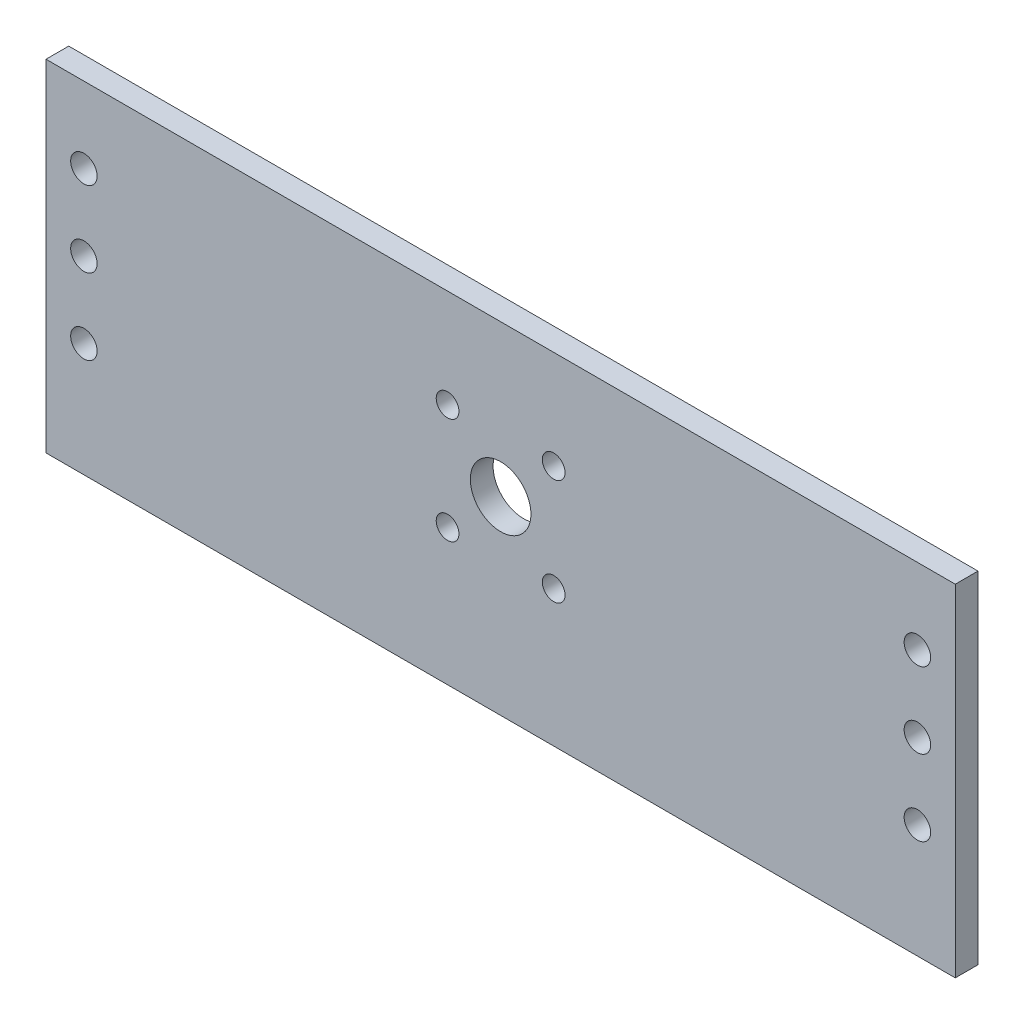
ISO-10303-21;
HEADER;
FILE_DESCRIPTION(('STEP AP214'),'2;1');
FILE_NAME('part.step','',(''),(''),'','','');
FILE_SCHEMA(('AUTOMOTIVE_DESIGN { 1 0 10303 214 1 1 1 1 }'));
ENDSEC;
DATA;
#1=APPLICATION_CONTEXT('core data for automotive mechanical design processes');
#2=APPLICATION_PROTOCOL_DEFINITION('international standard','automotive_design',2000,#1);
#3=PRODUCT_CONTEXT('',#1,'mechanical');
#4=PRODUCT('Part','Part','',(#3));
#5=PRODUCT_RELATED_PRODUCT_CATEGORY('part','',(#4));
#6=PRODUCT_DEFINITION_FORMATION('','',#4);
#7=PRODUCT_DEFINITION_CONTEXT('part definition',#1,'design');
#8=PRODUCT_DEFINITION('design','',#6,#7);
#9=PRODUCT_DEFINITION_SHAPE('','',#8);
#10=(LENGTH_UNIT() NAMED_UNIT(*) SI_UNIT(.MILLI.,.METRE.));
#11=(NAMED_UNIT(*) PLANE_ANGLE_UNIT() SI_UNIT($,.RADIAN.));
#12=(NAMED_UNIT(*) SI_UNIT($,.STERADIAN.) SOLID_ANGLE_UNIT());
#13=UNCERTAINTY_MEASURE_WITH_UNIT(LENGTH_MEASURE(1.E-05),#10,'distance_accuracy_value','');
#14=(GEOMETRIC_REPRESENTATION_CONTEXT(3) GLOBAL_UNCERTAINTY_ASSIGNED_CONTEXT((#13)) GLOBAL_UNIT_ASSIGNED_CONTEXT((#10,
#11,#12)) REPRESENTATION_CONTEXT('',''));
#15=CARTESIAN_POINT('',(0.,0.,0.));
#16=DIRECTION('',(0.,0.,1.));
#17=DIRECTION('',(1.,0.,0.));
#18=AXIS2_PLACEMENT_3D('',#15,#16,#17);
#19=CARTESIAN_POINT('',(-60.,-22.5,3.));
#20=DIRECTION('',(1.,0.,0.));
#21=DIRECTION('',(0.,0.,-1.));
#22=AXIS2_PLACEMENT_3D('',#19,#20,#21);
#23=PLANE('',#22);
#24=DIRECTION('',(0.,-1.,0.));
#25=VECTOR('',#24,1.);
#26=CARTESIAN_POINT('',(-60.,-22.5,0.));
#27=LINE('',#26,#25);
#28=CARTESIAN_POINT('',(-60.,22.5,0.));
#29=VERTEX_POINT('',#28);
#30=CARTESIAN_POINT('',(-60.,-22.5,0.));
#31=VERTEX_POINT('',#30);
#32=EDGE_CURVE('E101',#29,#31,#27,.T.);
#33=ORIENTED_EDGE('',*,*,#32,.T.);
#34=DIRECTION('',(0.,0.,-1.));
#35=VECTOR('',#34,1.);
#36=CARTESIAN_POINT('',(-60.,-22.5,3.));
#37=LINE('',#36,#35);
#38=CARTESIAN_POINT('',(-60.,-22.5,3.));
#39=VERTEX_POINT('',#38);
#40=EDGE_CURVE('E11',#39,#31,#37,.T.);
#41=ORIENTED_EDGE('',*,*,#40,.F.);
#42=DIRECTION('',(0.,-1.,0.));
#43=VECTOR('',#42,1.);
#44=CARTESIAN_POINT('',(-60.,-22.5,3.));
#45=LINE('',#44,#43);
#46=CARTESIAN_POINT('',(-60.,22.5,3.));
#47=VERTEX_POINT('',#46);
#48=EDGE_CURVE('E88',#47,#39,#45,.T.);
#49=ORIENTED_EDGE('',*,*,#48,.F.);
#50=DIRECTION('',(0.,0.,-1.));
#51=VECTOR('',#50,1.);
#52=CARTESIAN_POINT('',(-60.,22.5,3.));
#53=LINE('',#52,#51);
#54=EDGE_CURVE('E97',#47,#29,#53,.T.);
#55=ORIENTED_EDGE('',*,*,#54,.T.);
#56=EDGE_LOOP('',(#33,#41,#49,#55));
#57=FACE_BOUND('',#56,.T.);
#58=ADVANCED_FACE('F35',(#57),#23,.F.);
#59=CARTESIAN_POINT('',(60.,-22.5,3.));
#60=DIRECTION('',(0.,1.,0.));
#61=DIRECTION('',(-1.,0.,0.));
#62=AXIS2_PLACEMENT_3D('',#59,#60,#61);
#63=PLANE('',#62);
#64=DIRECTION('',(1.,0.,0.));
#65=VECTOR('',#64,1.);
#66=CARTESIAN_POINT('',(60.,-22.5,0.));
#67=LINE('',#66,#65);
#68=CARTESIAN_POINT('',(60.,-22.5,0.));
#69=VERTEX_POINT('',#68);
#70=EDGE_CURVE('E92',#31,#69,#67,.T.);
#71=ORIENTED_EDGE('',*,*,#70,.T.);
#72=DIRECTION('',(0.,0.,-1.));
#73=VECTOR('',#72,1.);
#74=CARTESIAN_POINT('',(60.,-22.5,3.));
#75=LINE('',#74,#73);
#76=CARTESIAN_POINT('',(60.,-22.5,3.));
#77=VERTEX_POINT('',#76);
#78=EDGE_CURVE('E44',#77,#69,#75,.T.);
#79=ORIENTED_EDGE('',*,*,#78,.F.);
#80=DIRECTION('',(1.,0.,0.));
#81=VECTOR('',#80,1.);
#82=CARTESIAN_POINT('',(60.,-22.5,3.));
#83=LINE('',#82,#81);
#84=EDGE_CURVE('E83',#39,#77,#83,.T.);
#85=ORIENTED_EDGE('',*,*,#84,.F.);
#86=ORIENTED_EDGE('',*,*,#40,.T.);
#87=EDGE_LOOP('',(#71,#79,#85,#86));
#88=FACE_BOUND('',#87,.T.);
#89=ADVANCED_FACE('F91',(#88),#63,.F.);
#90=CARTESIAN_POINT('',(60.,-22.5,3.));
#91=DIRECTION('',(-1.,0.,0.));
#92=DIRECTION('',(0.,0.,1.));
#93=AXIS2_PLACEMENT_3D('',#90,#91,#92);
#94=PLANE('',#93);
#95=DIRECTION('',(0.,1.,0.));
#96=VECTOR('',#95,1.);
#97=CARTESIAN_POINT('',(60.,-22.5,0.));
#98=LINE('',#97,#96);
#99=CARTESIAN_POINT('',(60.,22.5,0.));
#100=VERTEX_POINT('',#99);
#101=EDGE_CURVE('E70',#69,#100,#98,.T.);
#102=ORIENTED_EDGE('',*,*,#101,.T.);
#103=DIRECTION('',(0.,0.,-1.));
#104=VECTOR('',#103,1.);
#105=CARTESIAN_POINT('',(60.,22.5,3.));
#106=LINE('',#105,#104);
#107=CARTESIAN_POINT('',(60.,22.5,3.));
#108=VERTEX_POINT('',#107);
#109=EDGE_CURVE('E93',#108,#100,#106,.T.);
#110=ORIENTED_EDGE('',*,*,#109,.F.);
#111=DIRECTION('',(0.,1.,0.));
#112=VECTOR('',#111,1.);
#113=CARTESIAN_POINT('',(60.,-22.5,3.));
#114=LINE('',#113,#112);
#115=EDGE_CURVE('E86',#77,#108,#114,.T.);
#116=ORIENTED_EDGE('',*,*,#115,.F.);
#117=ORIENTED_EDGE('',*,*,#78,.T.);
#118=EDGE_LOOP('',(#102,#110,#116,#117));
#119=FACE_BOUND('',#118,.T.);
#120=ADVANCED_FACE('F95',(#119),#94,.F.);
#121=CARTESIAN_POINT('',(60.,22.5,3.));
#122=DIRECTION('',(0.,-1.,0.));
#123=DIRECTION('',(1.,0.,0.));
#124=AXIS2_PLACEMENT_3D('',#121,#122,#123);
#125=PLANE('',#124);
#126=DIRECTION('',(-1.,0.,0.));
#127=VECTOR('',#126,1.);
#128=CARTESIAN_POINT('',(60.,22.5,0.));
#129=LINE('',#128,#127);
#130=EDGE_CURVE('E76',#100,#29,#129,.T.);
#131=ORIENTED_EDGE('',*,*,#130,.T.);
#132=ORIENTED_EDGE('',*,*,#54,.F.);
#133=DIRECTION('',(-1.,0.,0.));
#134=VECTOR('',#133,1.);
#135=CARTESIAN_POINT('',(60.,22.5,3.));
#136=LINE('',#135,#134);
#137=EDGE_CURVE('E53',#108,#47,#136,.T.);
#138=ORIENTED_EDGE('',*,*,#137,.F.);
#139=ORIENTED_EDGE('',*,*,#109,.T.);
#140=EDGE_LOOP('',(#131,#132,#138,#139));
#141=FACE_BOUND('',#140,.T.);
#142=ADVANCED_FACE('F175',(#141),#125,.F.);
#143=CARTESIAN_POINT('',(0.,0.,3.));
#144=DIRECTION('',(0.,0.,1.));
#145=DIRECTION('',(1.,0.,0.));
#146=AXIS2_PLACEMENT_3D('',#143,#144,#145);
#147=PLANE('',#146);
#148=CARTESIAN_POINT('',(7.,9.5,3.));
#149=DIRECTION('',(0.,0.,1.));
#150=DIRECTION('',(1.,0.,0.));
#151=AXIS2_PLACEMENT_3D('',#148,#149,#150);
#152=CIRCLE('',#151,1.5);
#153=CARTESIAN_POINT('',(8.5,9.5,3.));
#154=VERTEX_POINT('',#153);
#155=EDGE_CURVE('E335',#154,#154,#152,.T.);
#156=ORIENTED_EDGE('',*,*,#155,.F.);
#157=EDGE_LOOP('',(#156));
#158=FACE_BOUND('',#157,.T.);
#159=CARTESIAN_POINT('',(-7.,9.5,3.));
#160=DIRECTION('',(0.,0.,1.));
#161=DIRECTION('',(1.,0.,0.));
#162=AXIS2_PLACEMENT_3D('',#159,#160,#161);
#163=CIRCLE('',#162,1.5);
#164=CARTESIAN_POINT('',(-5.5,9.5,3.));
#165=VERTEX_POINT('',#164);
#166=EDGE_CURVE('E329',#165,#165,#163,.T.);
#167=ORIENTED_EDGE('',*,*,#166,.F.);
#168=EDGE_LOOP('',(#167));
#169=FACE_BOUND('',#168,.T.);
#170=CARTESIAN_POINT('',(0.,2.5,3.));
#171=DIRECTION('',(0.,0.,1.));
#172=DIRECTION('',(1.,0.,0.));
#173=AXIS2_PLACEMENT_3D('',#170,#171,#172);
#174=CIRCLE('',#173,4.);
#175=CARTESIAN_POINT('',(4.,2.5,3.));
#176=VERTEX_POINT('',#175);
#177=EDGE_CURVE('E300',#176,#176,#174,.T.);
#178=ORIENTED_EDGE('',*,*,#177,.F.);
#179=EDGE_LOOP('',(#178));
#180=FACE_BOUND('',#179,.T.);
#181=CARTESIAN_POINT('',(55.,2.50000000000001,3.));
#182=DIRECTION('',(0.,0.,1.));
#183=DIRECTION('',(-1.,0.,0.));
#184=AXIS2_PLACEMENT_3D('',#181,#182,#183);
#185=CIRCLE('',#184,1.74759299465095);
#186=CARTESIAN_POINT('',(53.2524070053491,2.50000000000001,3.));
#187=VERTEX_POINT('',#186);
#188=EDGE_CURVE('E328',#187,#187,#185,.T.);
#189=ORIENTED_EDGE('',*,*,#188,.F.);
#190=EDGE_LOOP('',(#189));
#191=FACE_BOUND('',#190,.T.);
#192=CARTESIAN_POINT('',(55.,-7.50000000000001,3.));
#193=DIRECTION('',(0.,0.,1.));
#194=DIRECTION('',(-1.,0.,0.));
#195=AXIS2_PLACEMENT_3D('',#192,#193,#194);
#196=CIRCLE('',#195,1.74759299465095);
#197=CARTESIAN_POINT('',(53.252407005349,-7.50000000000001,3.));
#198=VERTEX_POINT('',#197);
#199=EDGE_CURVE('E332',#198,#198,#196,.T.);
#200=ORIENTED_EDGE('',*,*,#199,.F.);
#201=EDGE_LOOP('',(#200));
#202=FACE_BOUND('',#201,.T.);
#203=CARTESIAN_POINT('',(-55.,-7.50000000000001,3.));
#204=DIRECTION('',(0.,0.,1.));
#205=DIRECTION('',(1.,0.,0.));
#206=AXIS2_PLACEMENT_3D('',#203,#204,#205);
#207=CIRCLE('',#206,1.74759299465095);
#208=CARTESIAN_POINT('',(-53.252407005349,-7.50000000000001,3.));
#209=VERTEX_POINT('',#208);
#210=EDGE_CURVE('E347',#209,#209,#207,.T.);
#211=ORIENTED_EDGE('',*,*,#210,.F.);
#212=EDGE_LOOP('',(#211));
#213=FACE_BOUND('',#212,.T.);
#214=CARTESIAN_POINT('',(-55.,2.5,3.));
#215=DIRECTION('',(0.,0.,1.));
#216=DIRECTION('',(1.,0.,0.));
#217=AXIS2_PLACEMENT_3D('',#214,#215,#216);
#218=CIRCLE('',#217,1.74759299465095);
#219=CARTESIAN_POINT('',(-53.252407005349,2.5,3.));
#220=VERTEX_POINT('',#219);
#221=EDGE_CURVE('E344',#220,#220,#218,.T.);
#222=ORIENTED_EDGE('',*,*,#221,.F.);
#223=EDGE_LOOP('',(#222));
#224=FACE_BOUND('',#223,.T.);
#225=CARTESIAN_POINT('',(55.,12.5,3.));
#226=DIRECTION('',(0.,0.,1.));
#227=DIRECTION('',(1.,0.,0.));
#228=AXIS2_PLACEMENT_3D('',#225,#226,#227);
#229=CIRCLE('',#228,1.74759299465095);
#230=CARTESIAN_POINT('',(56.7475929946509,12.5,3.));
#231=VERTEX_POINT('',#230);
#232=EDGE_CURVE('E341',#231,#231,#229,.T.);
#233=ORIENTED_EDGE('',*,*,#232,.F.);
#234=EDGE_LOOP('',(#233));
#235=FACE_BOUND('',#234,.T.);
#236=CARTESIAN_POINT('',(7.,-4.5,3.));
#237=DIRECTION('',(0.,0.,1.));
#238=DIRECTION('',(1.,0.,0.));
#239=AXIS2_PLACEMENT_3D('',#236,#237,#238);
#240=CIRCLE('',#239,1.5);
#241=CARTESIAN_POINT('',(8.5,-4.5,3.));
#242=VERTEX_POINT('',#241);
#243=EDGE_CURVE('E340',#242,#242,#240,.T.);
#244=ORIENTED_EDGE('',*,*,#243,.F.);
#245=EDGE_LOOP('',(#244));
#246=FACE_BOUND('',#245,.T.);
#247=CARTESIAN_POINT('',(-7.,-4.5,3.));
#248=DIRECTION('',(0.,0.,1.));
#249=DIRECTION('',(1.,0.,0.));
#250=AXIS2_PLACEMENT_3D('',#247,#248,#249);
#251=CIRCLE('',#250,1.5);
#252=CARTESIAN_POINT('',(-5.5,-4.5,3.));
#253=VERTEX_POINT('',#252);
#254=EDGE_CURVE('E369',#253,#253,#251,.T.);
#255=ORIENTED_EDGE('',*,*,#254,.F.);
#256=EDGE_LOOP('',(#255));
#257=FACE_BOUND('',#256,.T.);
#258=CARTESIAN_POINT('',(-55.,12.5,3.));
#259=DIRECTION('',(0.,0.,1.));
#260=DIRECTION('',(1.,0.,0.));
#261=AXIS2_PLACEMENT_3D('',#258,#259,#260);
#262=CIRCLE('',#261,1.74759299465095);
#263=CARTESIAN_POINT('',(-53.252407005349,12.5,3.));
#264=VERTEX_POINT('',#263);
#265=EDGE_CURVE('E113',#264,#264,#262,.T.);
#266=ORIENTED_EDGE('',*,*,#265,.F.);
#267=EDGE_LOOP('',(#266));
#268=FACE_BOUND('',#267,.T.);
#269=ORIENTED_EDGE('',*,*,#48,.T.);
#270=ORIENTED_EDGE('',*,*,#84,.T.);
#271=ORIENTED_EDGE('',*,*,#115,.T.);
#272=ORIENTED_EDGE('',*,*,#137,.T.);
#273=EDGE_LOOP('',(#269,#270,#271,#272));
#274=FACE_BOUND('',#273,.T.);
#275=ADVANCED_FACE('F84',(#158,#169,#180,#191,#202,#213,#224,#235,#246,#257,#268,#274),#147,.T.);
#276=CARTESIAN_POINT('',(0.,0.,0.));
#277=DIRECTION('',(0.,0.,1.));
#278=DIRECTION('',(1.,0.,0.));
#279=AXIS2_PLACEMENT_3D('',#276,#277,#278);
#280=PLANE('',#279);
#281=CARTESIAN_POINT('',(7.,9.5,0.));
#282=DIRECTION('',(0.,0.,1.));
#283=DIRECTION('',(1.,0.,0.));
#284=AXIS2_PLACEMENT_3D('',#281,#282,#283);
#285=CIRCLE('',#284,1.5);
#286=CARTESIAN_POINT('',(8.5,9.5,0.));
#287=VERTEX_POINT('',#286);
#288=EDGE_CURVE('E38',#287,#287,#285,.T.);
#289=ORIENTED_EDGE('',*,*,#288,.T.);
#290=EDGE_LOOP('',(#289));
#291=FACE_BOUND('',#290,.T.);
#292=CARTESIAN_POINT('',(-7.,9.5,0.));
#293=DIRECTION('',(0.,0.,1.));
#294=DIRECTION('',(1.,0.,0.));
#295=AXIS2_PLACEMENT_3D('',#292,#293,#294);
#296=CIRCLE('',#295,1.5);
#297=CARTESIAN_POINT('',(-5.5,9.5,0.));
#298=VERTEX_POINT('',#297);
#299=EDGE_CURVE('E136',#298,#298,#296,.T.);
#300=ORIENTED_EDGE('',*,*,#299,.T.);
#301=EDGE_LOOP('',(#300));
#302=FACE_BOUND('',#301,.T.);
#303=CARTESIAN_POINT('',(0.,2.5,0.));
#304=DIRECTION('',(0.,0.,1.));
#305=DIRECTION('',(1.,0.,0.));
#306=AXIS2_PLACEMENT_3D('',#303,#304,#305);
#307=CIRCLE('',#306,4.);
#308=CARTESIAN_POINT('',(4.,2.5,0.));
#309=VERTEX_POINT('',#308);
#310=EDGE_CURVE('E134',#309,#309,#307,.T.);
#311=ORIENTED_EDGE('',*,*,#310,.T.);
#312=EDGE_LOOP('',(#311));
#313=FACE_BOUND('',#312,.T.);
#314=CARTESIAN_POINT('',(55.,2.50000000000001,0.));
#315=DIRECTION('',(0.,0.,1.));
#316=DIRECTION('',(1.,0.,0.));
#317=AXIS2_PLACEMENT_3D('',#314,#315,#316);
#318=CIRCLE('',#317,1.74759299465095);
#319=CARTESIAN_POINT('',(56.747592994651,2.50000000000001,0.));
#320=VERTEX_POINT('',#319);
#321=EDGE_CURVE('E131',#320,#320,#318,.T.);
#322=ORIENTED_EDGE('',*,*,#321,.T.);
#323=EDGE_LOOP('',(#322));
#324=FACE_BOUND('',#323,.T.);
#325=CARTESIAN_POINT('',(55.,-7.50000000000001,0.));
#326=DIRECTION('',(0.,0.,1.));
#327=DIRECTION('',(1.,0.,0.));
#328=AXIS2_PLACEMENT_3D('',#325,#326,#327);
#329=CIRCLE('',#328,1.74759299465095);
#330=CARTESIAN_POINT('',(56.7475929946509,-7.50000000000001,0.));
#331=VERTEX_POINT('',#330);
#332=EDGE_CURVE('E128',#331,#331,#329,.T.);
#333=ORIENTED_EDGE('',*,*,#332,.T.);
#334=EDGE_LOOP('',(#333));
#335=FACE_BOUND('',#334,.T.);
#336=CARTESIAN_POINT('',(-55.,-7.50000000000001,0.));
#337=DIRECTION('',(0.,0.,1.));
#338=DIRECTION('',(1.,0.,0.));
#339=AXIS2_PLACEMENT_3D('',#336,#337,#338);
#340=CIRCLE('',#339,1.74759299465095);
#341=CARTESIAN_POINT('',(-53.252407005349,-7.50000000000001,0.));
#342=VERTEX_POINT('',#341);
#343=EDGE_CURVE('E125',#342,#342,#340,.T.);
#344=ORIENTED_EDGE('',*,*,#343,.T.);
#345=EDGE_LOOP('',(#344));
#346=FACE_BOUND('',#345,.T.);
#347=CARTESIAN_POINT('',(-55.,2.5,0.));
#348=DIRECTION('',(0.,0.,1.));
#349=DIRECTION('',(1.,0.,0.));
#350=AXIS2_PLACEMENT_3D('',#347,#348,#349);
#351=CIRCLE('',#350,1.74759299465095);
#352=CARTESIAN_POINT('',(-53.252407005349,2.5,0.));
#353=VERTEX_POINT('',#352);
#354=EDGE_CURVE('E122',#353,#353,#351,.T.);
#355=ORIENTED_EDGE('',*,*,#354,.T.);
#356=EDGE_LOOP('',(#355));
#357=FACE_BOUND('',#356,.T.);
#358=CARTESIAN_POINT('',(55.,12.5,0.));
#359=DIRECTION('',(0.,0.,1.));
#360=DIRECTION('',(1.,0.,0.));
#361=AXIS2_PLACEMENT_3D('',#358,#359,#360);
#362=CIRCLE('',#361,1.74759299465095);
#363=CARTESIAN_POINT('',(56.7475929946509,12.5,0.));
#364=VERTEX_POINT('',#363);
#365=EDGE_CURVE('E119',#364,#364,#362,.T.);
#366=ORIENTED_EDGE('',*,*,#365,.T.);
#367=EDGE_LOOP('',(#366));
#368=FACE_BOUND('',#367,.T.);
#369=CARTESIAN_POINT('',(7.,-4.5,0.));
#370=DIRECTION('',(0.,0.,1.));
#371=DIRECTION('',(1.,0.,0.));
#372=AXIS2_PLACEMENT_3D('',#369,#370,#371);
#373=CIRCLE('',#372,1.5);
#374=CARTESIAN_POINT('',(8.5,-4.5,0.));
#375=VERTEX_POINT('',#374);
#376=EDGE_CURVE('E116',#375,#375,#373,.T.);
#377=ORIENTED_EDGE('',*,*,#376,.T.);
#378=EDGE_LOOP('',(#377));
#379=FACE_BOUND('',#378,.T.);
#380=CARTESIAN_POINT('',(-7.,-4.5,0.));
#381=DIRECTION('',(0.,0.,1.));
#382=DIRECTION('',(1.,0.,0.));
#383=AXIS2_PLACEMENT_3D('',#380,#381,#382);
#384=CIRCLE('',#383,1.5);
#385=CARTESIAN_POINT('',(-5.5,-4.5,0.));
#386=VERTEX_POINT('',#385);
#387=EDGE_CURVE('E112',#386,#386,#384,.T.);
#388=ORIENTED_EDGE('',*,*,#387,.T.);
#389=EDGE_LOOP('',(#388));
#390=FACE_BOUND('',#389,.T.);
#391=CARTESIAN_POINT('',(-55.,12.5,0.));
#392=DIRECTION('',(0.,0.,1.));
#393=DIRECTION('',(1.,0.,0.));
#394=AXIS2_PLACEMENT_3D('',#391,#392,#393);
#395=CIRCLE('',#394,1.74759299465095);
#396=CARTESIAN_POINT('',(-53.252407005349,12.5,0.));
#397=VERTEX_POINT('',#396);
#398=EDGE_CURVE('E109',#397,#397,#395,.T.);
#399=ORIENTED_EDGE('',*,*,#398,.T.);
#400=EDGE_LOOP('',(#399));
#401=FACE_BOUND('',#400,.T.);
#402=ORIENTED_EDGE('',*,*,#32,.F.);
#403=ORIENTED_EDGE('',*,*,#130,.F.);
#404=ORIENTED_EDGE('',*,*,#101,.F.);
#405=ORIENTED_EDGE('',*,*,#70,.F.);
#406=EDGE_LOOP('',(#402,#403,#404,#405));
#407=FACE_BOUND('',#406,.T.);
#408=ADVANCED_FACE('F143',(#291,#302,#313,#324,#335,#346,#357,#368,#379,#390,#401,#407),#280,.F.);
#409=CARTESIAN_POINT('',(-55.,12.5,-7.));
#410=DIRECTION('',(0.,0.,1.));
#411=DIRECTION('',(1.,0.,0.));
#412=AXIS2_PLACEMENT_3D('',#409,#410,#411);
#413=CYLINDRICAL_SURFACE('',#412,1.74759299465095);
#414=ORIENTED_EDGE('',*,*,#265,.T.);
#415=EDGE_LOOP('',(#414));
#416=FACE_BOUND('',#415,.T.);
#417=ORIENTED_EDGE('',*,*,#398,.F.);
#418=EDGE_LOOP('',(#417));
#419=FACE_BOUND('',#418,.T.);
#420=ADVANCED_FACE('F166',(#416,#419),#413,.F.);
#421=CARTESIAN_POINT('',(-7.,-4.5,-7.));
#422=DIRECTION('',(0.,0.,1.));
#423=DIRECTION('',(1.,0.,0.));
#424=AXIS2_PLACEMENT_3D('',#421,#422,#423);
#425=CYLINDRICAL_SURFACE('',#424,1.5);
#426=ORIENTED_EDGE('',*,*,#254,.T.);
#427=EDGE_LOOP('',(#426));
#428=FACE_BOUND('',#427,.T.);
#429=ORIENTED_EDGE('',*,*,#387,.F.);
#430=EDGE_LOOP('',(#429));
#431=FACE_BOUND('',#430,.T.);
#432=ADVANCED_FACE('F172',(#428,#431),#425,.F.);
#433=CARTESIAN_POINT('',(7.,-4.5,-7.));
#434=DIRECTION('',(0.,0.,1.));
#435=DIRECTION('',(1.,0.,0.));
#436=AXIS2_PLACEMENT_3D('',#433,#434,#435);
#437=CYLINDRICAL_SURFACE('',#436,1.5);
#438=ORIENTED_EDGE('',*,*,#243,.T.);
#439=EDGE_LOOP('',(#438));
#440=FACE_BOUND('',#439,.T.);
#441=ORIENTED_EDGE('',*,*,#376,.F.);
#442=EDGE_LOOP('',(#441));
#443=FACE_BOUND('',#442,.T.);
#444=ADVANCED_FACE('F215',(#440,#443),#437,.F.);
#445=CARTESIAN_POINT('',(55.,12.5,-7.));
#446=DIRECTION('',(0.,0.,1.));
#447=DIRECTION('',(1.,0.,0.));
#448=AXIS2_PLACEMENT_3D('',#445,#446,#447);
#449=CYLINDRICAL_SURFACE('',#448,1.74759299465095);
#450=ORIENTED_EDGE('',*,*,#232,.T.);
#451=EDGE_LOOP('',(#450));
#452=FACE_BOUND('',#451,.T.);
#453=ORIENTED_EDGE('',*,*,#365,.F.);
#454=EDGE_LOOP('',(#453));
#455=FACE_BOUND('',#454,.T.);
#456=ADVANCED_FACE('F225',(#452,#455),#449,.F.);
#457=CARTESIAN_POINT('',(-55.,2.5,-7.));
#458=DIRECTION('',(0.,0.,1.));
#459=DIRECTION('',(1.,0.,0.));
#460=AXIS2_PLACEMENT_3D('',#457,#458,#459);
#461=CYLINDRICAL_SURFACE('',#460,1.74759299465095);
#462=ORIENTED_EDGE('',*,*,#221,.T.);
#463=EDGE_LOOP('',(#462));
#464=FACE_BOUND('',#463,.T.);
#465=ORIENTED_EDGE('',*,*,#354,.F.);
#466=EDGE_LOOP('',(#465));
#467=FACE_BOUND('',#466,.T.);
#468=ADVANCED_FACE('F235',(#464,#467),#461,.F.);
#469=CARTESIAN_POINT('',(-55.,-7.50000000000001,-7.));
#470=DIRECTION('',(0.,0.,1.));
#471=DIRECTION('',(1.,0.,0.));
#472=AXIS2_PLACEMENT_3D('',#469,#470,#471);
#473=CYLINDRICAL_SURFACE('',#472,1.74759299465095);
#474=ORIENTED_EDGE('',*,*,#210,.T.);
#475=EDGE_LOOP('',(#474));
#476=FACE_BOUND('',#475,.T.);
#477=ORIENTED_EDGE('',*,*,#343,.F.);
#478=EDGE_LOOP('',(#477));
#479=FACE_BOUND('',#478,.T.);
#480=ADVANCED_FACE('F244',(#476,#479),#473,.F.);
#481=CARTESIAN_POINT('',(55.,-7.50000000000001,-7.));
#482=DIRECTION('',(0.,0.,1.));
#483=DIRECTION('',(1.,0.,0.));
#484=AXIS2_PLACEMENT_3D('',#481,#482,#483);
#485=CYLINDRICAL_SURFACE('',#484,1.74759299465095);
#486=ORIENTED_EDGE('',*,*,#199,.T.);
#487=EDGE_LOOP('',(#486));
#488=FACE_BOUND('',#487,.T.);
#489=ORIENTED_EDGE('',*,*,#332,.F.);
#490=EDGE_LOOP('',(#489));
#491=FACE_BOUND('',#490,.T.);
#492=ADVANCED_FACE('F254',(#488,#491),#485,.F.);
#493=CARTESIAN_POINT('',(55.,2.50000000000001,-7.));
#494=DIRECTION('',(0.,0.,1.));
#495=DIRECTION('',(1.,0.,0.));
#496=AXIS2_PLACEMENT_3D('',#493,#494,#495);
#497=CYLINDRICAL_SURFACE('',#496,1.74759299465095);
#498=ORIENTED_EDGE('',*,*,#188,.T.);
#499=EDGE_LOOP('',(#498));
#500=FACE_BOUND('',#499,.T.);
#501=ORIENTED_EDGE('',*,*,#321,.F.);
#502=EDGE_LOOP('',(#501));
#503=FACE_BOUND('',#502,.T.);
#504=ADVANCED_FACE('F264',(#500,#503),#497,.F.);
#505=CARTESIAN_POINT('',(0.,2.5,-7.));
#506=DIRECTION('',(0.,0.,1.));
#507=DIRECTION('',(1.,0.,0.));
#508=AXIS2_PLACEMENT_3D('',#505,#506,#507);
#509=CYLINDRICAL_SURFACE('',#508,4.);
#510=ORIENTED_EDGE('',*,*,#177,.T.);
#511=EDGE_LOOP('',(#510));
#512=FACE_BOUND('',#511,.T.);
#513=ORIENTED_EDGE('',*,*,#310,.F.);
#514=EDGE_LOOP('',(#513));
#515=FACE_BOUND('',#514,.T.);
#516=ADVANCED_FACE('F153',(#512,#515),#509,.F.);
#517=CARTESIAN_POINT('',(-7.,9.5,-7.));
#518=DIRECTION('',(0.,0.,1.));
#519=DIRECTION('',(1.,0.,0.));
#520=AXIS2_PLACEMENT_3D('',#517,#518,#519);
#521=CYLINDRICAL_SURFACE('',#520,1.5);
#522=ORIENTED_EDGE('',*,*,#166,.T.);
#523=EDGE_LOOP('',(#522));
#524=FACE_BOUND('',#523,.T.);
#525=ORIENTED_EDGE('',*,*,#299,.F.);
#526=EDGE_LOOP('',(#525));
#527=FACE_BOUND('',#526,.T.);
#528=ADVANCED_FACE('F147',(#524,#527),#521,.F.);
#529=CARTESIAN_POINT('',(7.,9.5,-7.));
#530=DIRECTION('',(0.,0.,1.));
#531=DIRECTION('',(1.,0.,0.));
#532=AXIS2_PLACEMENT_3D('',#529,#530,#531);
#533=CYLINDRICAL_SURFACE('',#532,1.5);
#534=ORIENTED_EDGE('',*,*,#155,.T.);
#535=EDGE_LOOP('',(#534));
#536=FACE_BOUND('',#535,.T.);
#537=ORIENTED_EDGE('',*,*,#288,.F.);
#538=EDGE_LOOP('',(#537));
#539=FACE_BOUND('',#538,.T.);
#540=ADVANCED_FACE('F145',(#536,#539),#533,.F.);
#541=CLOSED_SHELL('',(#58,#89,#120,#142,#275,#408,#420,#432,#444,#456,#468,#480,#492,#504,#516,
#528,#540));
#542=MANIFOLD_SOLID_BREP('B2',#541);
#543=ADVANCED_BREP_SHAPE_REPRESENTATION('',(#18,#542),#14);
#544=SHAPE_DEFINITION_REPRESENTATION(#9,#543);
ENDSEC;
END-ISO-10303-21;
